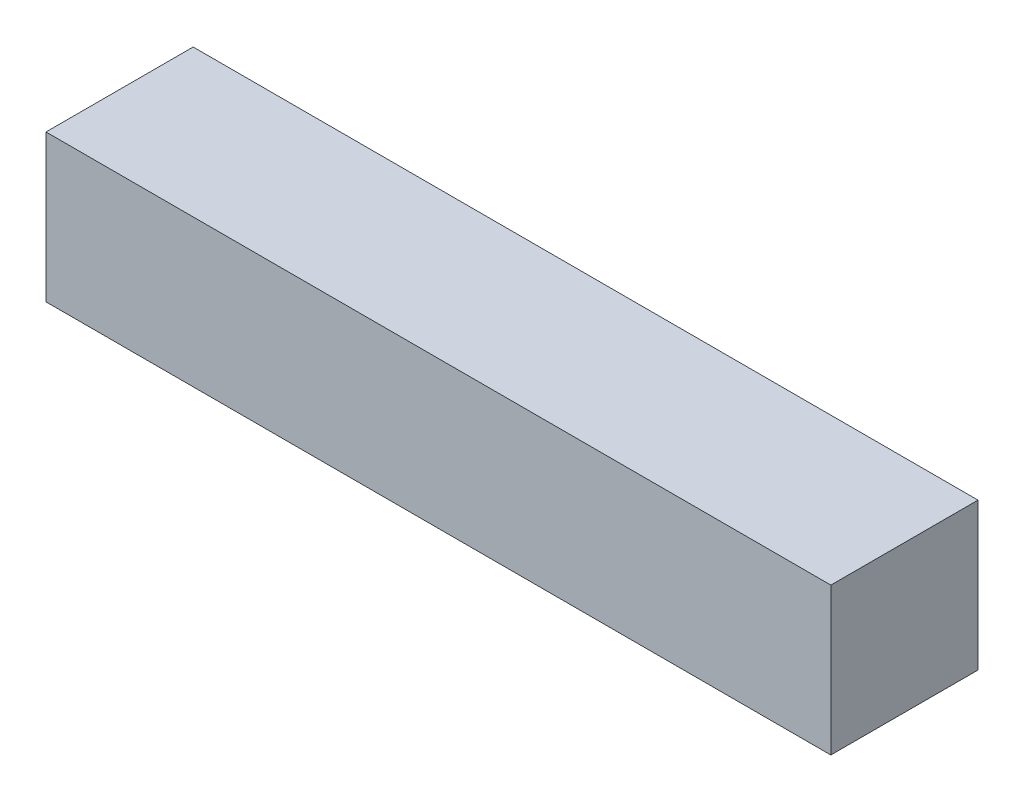
ISO-10303-21;
HEADER;
FILE_DESCRIPTION(('STEP AP214'),'2;1');
FILE_NAME('part.step','',(''),(''),'','','');
FILE_SCHEMA(('AUTOMOTIVE_DESIGN { 1 0 10303 214 1 1 1 1 }'));
ENDSEC;
DATA;
#1=APPLICATION_CONTEXT('core data for automotive mechanical design processes');
#2=APPLICATION_PROTOCOL_DEFINITION('international standard','automotive_design',2000,#1);
#3=PRODUCT_CONTEXT('',#1,'mechanical');
#4=PRODUCT('Part','Part','',(#3));
#5=PRODUCT_RELATED_PRODUCT_CATEGORY('part','',(#4));
#6=PRODUCT_DEFINITION_FORMATION('','',#4);
#7=PRODUCT_DEFINITION_CONTEXT('part definition',#1,'design');
#8=PRODUCT_DEFINITION('design','',#6,#7);
#9=PRODUCT_DEFINITION_SHAPE('','',#8);
#10=(LENGTH_UNIT() NAMED_UNIT(*) SI_UNIT(.MILLI.,.METRE.));
#11=(NAMED_UNIT(*) PLANE_ANGLE_UNIT() SI_UNIT($,.RADIAN.));
#12=(NAMED_UNIT(*) SI_UNIT($,.STERADIAN.) SOLID_ANGLE_UNIT());
#13=UNCERTAINTY_MEASURE_WITH_UNIT(LENGTH_MEASURE(1.E-05),#10,'distance_accuracy_value','');
#14=(GEOMETRIC_REPRESENTATION_CONTEXT(3) GLOBAL_UNCERTAINTY_ASSIGNED_CONTEXT((#13)) GLOBAL_UNIT_ASSIGNED_CONTEXT((#10,
#11,#12)) REPRESENTATION_CONTEXT('',''));
#15=CARTESIAN_POINT('',(0.,0.,0.));
#16=DIRECTION('',(0.,0.,1.));
#17=DIRECTION('',(1.,0.,0.));
#18=AXIS2_PLACEMENT_3D('',#15,#16,#17);
#19=CARTESIAN_POINT('',(-12.7,11.90625,2.38125));
#20=DIRECTION('',(0.,0.,1.));
#21=DIRECTION('',(1.,0.,0.));
#22=AXIS2_PLACEMENT_3D('',#19,#20,#21);
#23=PLANE('',#22);
#24=DIRECTION('',(1.,0.,0.));
#25=VECTOR('',#24,1.);
#26=CARTESIAN_POINT('',(-12.7,7.14375,2.38125));
#27=LINE('',#26,#25);
#28=CARTESIAN_POINT('',(12.7,7.14375,2.38125));
#29=VERTEX_POINT('',#28);
#30=CARTESIAN_POINT('',(-12.7,7.14375,2.38125));
#31=VERTEX_POINT('',#30);
#32=EDGE_CURVE('E20',#29,#31,#27,.F.);
#33=ORIENTED_EDGE('',*,*,#32,.F.);
#34=DIRECTION('',(0.,1.,0.));
#35=VECTOR('',#34,1.);
#36=CARTESIAN_POINT('',(12.7,0.,2.38125));
#37=LINE('',#36,#35);
#38=CARTESIAN_POINT('',(12.7,11.90625,2.38125));
#39=VERTEX_POINT('',#38);
#40=EDGE_CURVE('E80',#39,#29,#37,.F.);
#41=ORIENTED_EDGE('',*,*,#40,.F.);
#42=DIRECTION('',(1.,0.,0.));
#43=VECTOR('',#42,1.);
#44=CARTESIAN_POINT('',(-12.7,11.90625,2.38125));
#45=LINE('',#44,#43);
#46=CARTESIAN_POINT('',(-12.7,11.90625,2.38125));
#47=VERTEX_POINT('',#46);
#48=EDGE_CURVE('E61',#47,#39,#45,.T.);
#49=ORIENTED_EDGE('',*,*,#48,.F.);
#50=DIRECTION('',(0.,1.,0.));
#51=VECTOR('',#50,1.);
#52=CARTESIAN_POINT('',(-12.7,0.,2.38125));
#53=LINE('',#52,#51);
#54=EDGE_CURVE('E55',#47,#31,#53,.F.);
#55=ORIENTED_EDGE('',*,*,#54,.T.);
#56=EDGE_LOOP('',(#33,#41,#49,#55));
#57=FACE_BOUND('',#56,.T.);
#58=ADVANCED_FACE('F17',(#57),#23,.T.);
#59=CARTESIAN_POINT('',(-12.7,7.14375,2.38125));
#60=DIRECTION('',(0.,-1.,0.));
#61=DIRECTION('',(0.,0.,-1.));
#62=AXIS2_PLACEMENT_3D('',#59,#60,#61);
#63=PLANE('',#62);
#64=DIRECTION('',(-1.,0.,0.));
#65=VECTOR('',#64,1.);
#66=CARTESIAN_POINT('',(-12.7,7.14375,-2.38125));
#67=LINE('',#66,#65);
#68=CARTESIAN_POINT('',(12.7,7.14375,-2.38125));
#69=VERTEX_POINT('',#68);
#70=CARTESIAN_POINT('',(-12.7,7.14375,-2.38125));
#71=VERTEX_POINT('',#70);
#72=EDGE_CURVE('E83',#69,#71,#67,.T.);
#73=ORIENTED_EDGE('',*,*,#72,.F.);
#74=DIRECTION('',(0.,0.,-1.));
#75=VECTOR('',#74,1.);
#76=CARTESIAN_POINT('',(12.7,7.14375,0.));
#77=LINE('',#76,#75);
#78=EDGE_CURVE('E68',#29,#69,#77,.T.);
#79=ORIENTED_EDGE('',*,*,#78,.F.);
#80=ORIENTED_EDGE('',*,*,#32,.T.);
#81=DIRECTION('',(0.,0.,-1.));
#82=VECTOR('',#81,1.);
#83=CARTESIAN_POINT('',(-12.7,7.14375,0.));
#84=LINE('',#83,#82);
#85=EDGE_CURVE('E63',#31,#71,#84,.T.);
#86=ORIENTED_EDGE('',*,*,#85,.T.);
#87=EDGE_LOOP('',(#73,#79,#80,#86));
#88=FACE_BOUND('',#87,.T.);
#89=ADVANCED_FACE('F65',(#88),#63,.T.);
#90=CARTESIAN_POINT('',(-12.7,0.,0.));
#91=DIRECTION('',(1.,0.,0.));
#92=DIRECTION('',(0.,0.,-1.));
#93=AXIS2_PLACEMENT_3D('',#90,#91,#92);
#94=PLANE('',#93);
#95=ORIENTED_EDGE('',*,*,#85,.F.);
#96=ORIENTED_EDGE('',*,*,#54,.F.);
#97=DIRECTION('',(0.,0.,1.));
#98=VECTOR('',#97,1.);
#99=CARTESIAN_POINT('',(-12.7,11.90625,-2.38125));
#100=LINE('',#99,#98);
#101=CARTESIAN_POINT('',(-12.7,11.90625,-2.38125));
#102=VERTEX_POINT('',#101);
#103=EDGE_CURVE('E74',#102,#47,#100,.T.);
#104=ORIENTED_EDGE('',*,*,#103,.F.);
#105=DIRECTION('',(0.,1.,0.));
#106=VECTOR('',#105,1.);
#107=CARTESIAN_POINT('',(-12.7,7.14375,-2.38125));
#108=LINE('',#107,#106);
#109=EDGE_CURVE('E72',#71,#102,#108,.T.);
#110=ORIENTED_EDGE('',*,*,#109,.F.);
#111=EDGE_LOOP('',(#95,#96,#104,#110));
#112=FACE_BOUND('',#111,.T.);
#113=ADVANCED_FACE('F70',(#112),#94,.F.);
#114=CARTESIAN_POINT('',(-12.7,11.90625,-2.38125));
#115=DIRECTION('',(0.,1.,0.));
#116=DIRECTION('',(0.,0.,1.));
#117=AXIS2_PLACEMENT_3D('',#114,#115,#116);
#118=PLANE('',#117);
#119=ORIENTED_EDGE('',*,*,#48,.T.);
#120=DIRECTION('',(0.,0.,-1.));
#121=VECTOR('',#120,1.);
#122=CARTESIAN_POINT('',(12.7,11.90625,0.));
#123=LINE('',#122,#121);
#124=CARTESIAN_POINT('',(12.7,11.90625,-2.38125));
#125=VERTEX_POINT('',#124);
#126=EDGE_CURVE('E35',#125,#39,#123,.F.);
#127=ORIENTED_EDGE('',*,*,#126,.F.);
#128=DIRECTION('',(-1.,0.,0.));
#129=VECTOR('',#128,1.);
#130=CARTESIAN_POINT('',(-12.7,11.90625,-2.38125));
#131=LINE('',#130,#129);
#132=EDGE_CURVE('E26',#102,#125,#131,.F.);
#133=ORIENTED_EDGE('',*,*,#132,.F.);
#134=ORIENTED_EDGE('',*,*,#103,.T.);
#135=EDGE_LOOP('',(#119,#127,#133,#134));
#136=FACE_BOUND('',#135,.T.);
#137=ADVANCED_FACE('F89',(#136),#118,.T.);
#138=CARTESIAN_POINT('',(12.7,0.,0.));
#139=DIRECTION('',(1.,0.,0.));
#140=DIRECTION('',(0.,0.,-1.));
#141=AXIS2_PLACEMENT_3D('',#138,#139,#140);
#142=PLANE('',#141);
#143=ORIENTED_EDGE('',*,*,#78,.T.);
#144=DIRECTION('',(0.,1.,0.));
#145=VECTOR('',#144,1.);
#146=CARTESIAN_POINT('',(12.7,7.14375,-2.38125));
#147=LINE('',#146,#145);
#148=EDGE_CURVE('E11',#125,#69,#147,.F.);
#149=ORIENTED_EDGE('',*,*,#148,.F.);
#150=ORIENTED_EDGE('',*,*,#126,.T.);
#151=ORIENTED_EDGE('',*,*,#40,.T.);
#152=EDGE_LOOP('',(#143,#149,#150,#151));
#153=FACE_BOUND('',#152,.T.);
#154=ADVANCED_FACE('F91',(#153),#142,.T.);
#155=CARTESIAN_POINT('',(-12.7,7.14375,-2.38125));
#156=DIRECTION('',(0.,0.,-1.));
#157=DIRECTION('',(-1.,0.,0.));
#158=AXIS2_PLACEMENT_3D('',#155,#156,#157);
#159=PLANE('',#158);
#160=ORIENTED_EDGE('',*,*,#132,.T.);
#161=ORIENTED_EDGE('',*,*,#148,.T.);
#162=ORIENTED_EDGE('',*,*,#72,.T.);
#163=ORIENTED_EDGE('',*,*,#109,.T.);
#164=EDGE_LOOP('',(#160,#161,#162,#163));
#165=FACE_BOUND('',#164,.T.);
#166=ADVANCED_FACE('F88',(#165),#159,.T.);
#167=CLOSED_SHELL('',(#58,#89,#113,#137,#154,#166));
#168=MANIFOLD_SOLID_BREP('B1',#167);
#169=ADVANCED_BREP_SHAPE_REPRESENTATION('',(#18,#168),#14);
#170=SHAPE_DEFINITION_REPRESENTATION(#9,#169);
ENDSEC;
END-ISO-10303-21;
